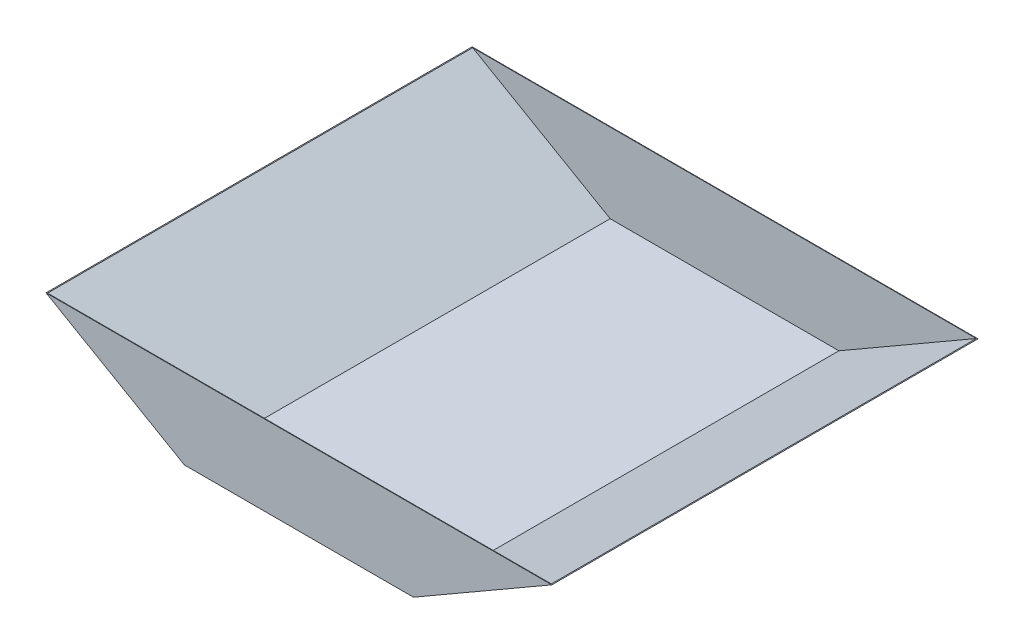
ISO-10303-21;
HEADER;
FILE_DESCRIPTION(('STEP AP214'),'2;1');
FILE_NAME('part.step','',(''),(''),'','','');
FILE_SCHEMA(('AUTOMOTIVE_DESIGN { 1 0 10303 214 1 1 1 1 }'));
ENDSEC;
DATA;
#1=APPLICATION_CONTEXT('core data for automotive mechanical design processes');
#2=APPLICATION_PROTOCOL_DEFINITION('international standard','automotive_design',2000,#1);
#3=PRODUCT_CONTEXT('',#1,'mechanical');
#4=PRODUCT('Part','Part','',(#3));
#5=PRODUCT_RELATED_PRODUCT_CATEGORY('part','',(#4));
#6=PRODUCT_DEFINITION_FORMATION('','',#4);
#7=PRODUCT_DEFINITION_CONTEXT('part definition',#1,'design');
#8=PRODUCT_DEFINITION('design','',#6,#7);
#9=PRODUCT_DEFINITION_SHAPE('','',#8);
#10=(LENGTH_UNIT() NAMED_UNIT(*) SI_UNIT(.MILLI.,.METRE.));
#11=(NAMED_UNIT(*) PLANE_ANGLE_UNIT() SI_UNIT($,.RADIAN.));
#12=(NAMED_UNIT(*) SI_UNIT($,.STERADIAN.) SOLID_ANGLE_UNIT());
#13=UNCERTAINTY_MEASURE_WITH_UNIT(LENGTH_MEASURE(1.E-05),#10,'distance_accuracy_value','');
#14=(GEOMETRIC_REPRESENTATION_CONTEXT(3) GLOBAL_UNCERTAINTY_ASSIGNED_CONTEXT((#13)) GLOBAL_UNIT_ASSIGNED_CONTEXT((#10,
#11,#12)) REPRESENTATION_CONTEXT('',''));
#15=CARTESIAN_POINT('',(0.,0.,0.));
#16=DIRECTION('',(0.,0.,1.));
#17=DIRECTION('',(1.,0.,0.));
#18=AXIS2_PLACEMENT_3D('',#15,#16,#17);
#19=CARTESIAN_POINT('',(-288.507789686385,150.,800.));
#20=DIRECTION('',(0.,-1.,0.));
#21=DIRECTION('',(1.,0.,0.));
#22=AXIS2_PLACEMENT_3D('',#19,#20,#21);
#23=PLANE('',#22);
#24=DIRECTION('',(-1.,0.,0.));
#25=VECTOR('',#24,1.);
#26=CARTESIAN_POINT('',(-288.507789686385,150.,0.));
#27=LINE('',#26,#25);
#28=CARTESIAN_POINT('',(-288.507789686385,150.,0.));
#29=VERTEX_POINT('',#28);
#30=CARTESIAN_POINT('',(-1238.12303195705,150.,0.));
#31=VERTEX_POINT('',#30);
#32=EDGE_CURVE('E78',#29,#31,#27,.T.);
#33=ORIENTED_EDGE('',*,*,#32,.T.);
#34=DIRECTION('',(0.,0.,-1.));
#35=VECTOR('',#34,1.);
#36=CARTESIAN_POINT('',(-1238.12303195705,150.,800.));
#37=LINE('',#36,#35);
#38=CARTESIAN_POINT('',(-1238.12303195705,150.,800.));
#39=VERTEX_POINT('',#38);
#40=EDGE_CURVE('E150',#39,#31,#37,.T.);
#41=ORIENTED_EDGE('',*,*,#40,.F.);
#42=DIRECTION('',(-1.,0.,0.));
#43=VECTOR('',#42,1.);
#44=CARTESIAN_POINT('',(-288.507789686385,150.,800.));
#45=LINE('',#44,#43);
#46=CARTESIAN_POINT('',(-288.507789686385,150.,800.));
#47=VERTEX_POINT('',#46);
#48=EDGE_CURVE('E57',#47,#39,#45,.T.);
#49=ORIENTED_EDGE('',*,*,#48,.F.);
#50=DIRECTION('',(0.,0.,-1.));
#51=VECTOR('',#50,1.);
#52=CARTESIAN_POINT('',(-288.507789686385,150.,800.));
#53=LINE('',#52,#51);
#54=EDGE_CURVE('E160',#47,#29,#53,.T.);
#55=ORIENTED_EDGE('',*,*,#54,.T.);
#56=EDGE_LOOP('',(#33,#41,#49,#55));
#57=FACE_BOUND('',#56,.T.);
#58=DIRECTION('',(-1.,0.,0.));
#59=VECTOR('',#58,1.);
#60=CARTESIAN_POINT('',(-288.507789686385,150.,1.));
#61=LINE('',#60,#59);
#62=CARTESIAN_POINT('',(-290.507789686385,150.,1.));
#63=VERTEX_POINT('',#62);
#64=CARTESIAN_POINT('',(-1236.12303195705,150.,1.));
#65=VERTEX_POINT('',#64);
#66=EDGE_CURVE('E131',#63,#65,#61,.T.);
#67=ORIENTED_EDGE('',*,*,#66,.F.);
#68=DIRECTION('',(0.,0.,-1.));
#69=VECTOR('',#68,1.);
#70=CARTESIAN_POINT('',(-290.507789686386,150.,800.));
#71=LINE('',#70,#69);
#72=CARTESIAN_POINT('',(-290.507789686385,150.,799.));
#73=VERTEX_POINT('',#72);
#74=EDGE_CURVE('E126',#73,#63,#71,.T.);
#75=ORIENTED_EDGE('',*,*,#74,.F.);
#76=DIRECTION('',(-1.,0.,0.));
#77=VECTOR('',#76,1.);
#78=CARTESIAN_POINT('',(-288.507789686385,150.,799.));
#79=LINE('',#78,#77);
#80=CARTESIAN_POINT('',(-1236.12303195705,150.,799.));
#81=VERTEX_POINT('',#80);
#82=EDGE_CURVE('E48',#73,#81,#79,.T.);
#83=ORIENTED_EDGE('',*,*,#82,.T.);
#84=DIRECTION('',(0.,0.,-1.));
#85=VECTOR('',#84,1.);
#86=CARTESIAN_POINT('',(-1236.12303195705,150.,800.));
#87=LINE('',#86,#85);
#88=EDGE_CURVE('E139',#81,#65,#87,.T.);
#89=ORIENTED_EDGE('',*,*,#88,.T.);
#90=EDGE_LOOP('',(#67,#75,#83,#89));
#91=FACE_BOUND('',#90,.T.);
#92=ADVANCED_FACE('F33',(#57,#91),#23,.F.);
#93=CARTESIAN_POINT('',(-1238.12303195705,150.,800.));
#94=DIRECTION('',(0.500000000000001,0.866025403784438,0.));
#95=DIRECTION('',(-0.866025403784438,0.500000000000001,0.));
#96=AXIS2_PLACEMENT_3D('',#93,#94,#95);
#97=PLANE('',#96);
#98=DIRECTION('',(0.866025403784438,-0.500000000000001,0.));
#99=VECTOR('',#98,1.);
#100=CARTESIAN_POINT('',(-1238.12303195705,150.,0.));
#101=LINE('',#100,#99);
#102=CARTESIAN_POINT('',(-978.315410821717,0.,0.));
#103=VERTEX_POINT('',#102);
#104=EDGE_CURVE('E151',#31,#103,#101,.T.);
#105=ORIENTED_EDGE('',*,*,#104,.T.);
#106=DIRECTION('',(0.,0.,-1.));
#107=VECTOR('',#106,1.);
#108=CARTESIAN_POINT('',(-978.315410821717,0.,800.));
#109=LINE('',#108,#107);
#110=CARTESIAN_POINT('',(-978.315410821717,0.,800.));
#111=VERTEX_POINT('',#110);
#112=EDGE_CURVE('E11',#111,#103,#109,.T.);
#113=ORIENTED_EDGE('',*,*,#112,.F.);
#114=DIRECTION('',(0.866025403784438,-0.500000000000001,0.));
#115=VECTOR('',#114,1.);
#116=CARTESIAN_POINT('',(-1238.12303195705,150.,800.));
#117=LINE('',#116,#115);
#118=EDGE_CURVE('E144',#39,#111,#117,.T.);
#119=ORIENTED_EDGE('',*,*,#118,.F.);
#120=ORIENTED_EDGE('',*,*,#40,.T.);
#121=EDGE_LOOP('',(#105,#113,#119,#120));
#122=FACE_BOUND('',#121,.T.);
#123=ADVANCED_FACE('F35',(#122),#97,.F.);
#124=CARTESIAN_POINT('',(-978.315410821717,0.,800.));
#125=DIRECTION('',(0.,1.,0.));
#126=DIRECTION('',(0.,0.,1.));
#127=AXIS2_PLACEMENT_3D('',#124,#125,#126);
#128=PLANE('',#127);
#129=DIRECTION('',(1.,0.,0.));
#130=VECTOR('',#129,1.);
#131=CARTESIAN_POINT('',(-978.315410821717,0.,0.));
#132=LINE('',#131,#130);
#133=CARTESIAN_POINT('',(-548.315410821717,0.,0.));
#134=VERTEX_POINT('',#133);
#135=EDGE_CURVE('E154',#103,#134,#132,.T.);
#136=ORIENTED_EDGE('',*,*,#135,.T.);
#137=DIRECTION('',(0.,0.,-1.));
#138=VECTOR('',#137,1.);
#139=CARTESIAN_POINT('',(-548.315410821717,0.,800.));
#140=LINE('',#139,#138);
#141=CARTESIAN_POINT('',(-548.315410821717,0.,800.));
#142=VERTEX_POINT('',#141);
#143=EDGE_CURVE('E41',#142,#134,#140,.T.);
#144=ORIENTED_EDGE('',*,*,#143,.F.);
#145=DIRECTION('',(1.,0.,0.));
#146=VECTOR('',#145,1.);
#147=CARTESIAN_POINT('',(-978.315410821717,0.,800.));
#148=LINE('',#147,#146);
#149=EDGE_CURVE('E85',#111,#142,#148,.T.);
#150=ORIENTED_EDGE('',*,*,#149,.F.);
#151=ORIENTED_EDGE('',*,*,#112,.T.);
#152=EDGE_LOOP('',(#136,#144,#150,#151));
#153=FACE_BOUND('',#152,.T.);
#154=ADVANCED_FACE('F199',(#153),#128,.F.);
#155=CARTESIAN_POINT('',(-548.315410821717,0.,800.));
#156=DIRECTION('',(-0.500000000000002,0.866025403784438,0.));
#157=DIRECTION('',(-0.866025403784438,-0.500000000000002,0.));
#158=AXIS2_PLACEMENT_3D('',#155,#156,#157);
#159=PLANE('',#158);
#160=DIRECTION('',(0.866025403784438,0.500000000000002,0.));
#161=VECTOR('',#160,1.);
#162=CARTESIAN_POINT('',(-548.315410821717,0.,0.));
#163=LINE('',#162,#161);
#164=EDGE_CURVE('E156',#134,#29,#163,.T.);
#165=ORIENTED_EDGE('',*,*,#164,.T.);
#166=ORIENTED_EDGE('',*,*,#54,.F.);
#167=DIRECTION('',(0.866025403784438,0.500000000000002,0.));
#168=VECTOR('',#167,1.);
#169=CARTESIAN_POINT('',(-548.315410821717,0.,800.));
#170=LINE('',#169,#168);
#171=EDGE_CURVE('E147',#142,#47,#170,.T.);
#172=ORIENTED_EDGE('',*,*,#171,.F.);
#173=ORIENTED_EDGE('',*,*,#143,.T.);
#174=EDGE_LOOP('',(#165,#166,#172,#173));
#175=FACE_BOUND('',#174,.T.);
#176=ADVANCED_FACE('F165',(#175),#159,.F.);
#177=CARTESIAN_POINT('',(0.,0.,800.));
#178=DIRECTION('',(0.,0.,1.));
#179=DIRECTION('',(1.,0.,0.));
#180=AXIS2_PLACEMENT_3D('',#177,#178,#179);
#181=PLANE('',#180);
#182=ORIENTED_EDGE('',*,*,#118,.T.);
#183=ORIENTED_EDGE('',*,*,#149,.T.);
#184=ORIENTED_EDGE('',*,*,#171,.T.);
#185=ORIENTED_EDGE('',*,*,#48,.T.);
#186=EDGE_LOOP('',(#182,#183,#184,#185));
#187=FACE_BOUND('',#186,.T.);
#188=ADVANCED_FACE('F193',(#187),#181,.T.);
#189=CARTESIAN_POINT('',(0.,0.,0.));
#190=DIRECTION('',(0.,0.,1.));
#191=DIRECTION('',(1.,0.,0.));
#192=AXIS2_PLACEMENT_3D('',#189,#190,#191);
#193=PLANE('',#192);
#194=ORIENTED_EDGE('',*,*,#104,.F.);
#195=ORIENTED_EDGE('',*,*,#32,.F.);
#196=ORIENTED_EDGE('',*,*,#164,.F.);
#197=ORIENTED_EDGE('',*,*,#135,.F.);
#198=EDGE_LOOP('',(#194,#195,#196,#197));
#199=FACE_BOUND('',#198,.T.);
#200=ADVANCED_FACE('F169',(#199),#193,.F.);
#201=CARTESIAN_POINT('',(-1237.62303195705,150.866025403785,800.));
#202=DIRECTION('',(0.500000000000001,0.866025403784438,0.));
#203=DIRECTION('',(-0.866025403784438,0.500000000000001,0.));
#204=AXIS2_PLACEMENT_3D('',#201,#202,#203);
#205=PLANE('',#204);
#206=DIRECTION('',(0.866025403784438,-0.500000000000001,0.));
#207=VECTOR('',#206,1.);
#208=CARTESIAN_POINT('',(-1237.62303195705,150.866025403785,1.));
#209=LINE('',#208,#207);
#210=CARTESIAN_POINT('',(-978.047461629286,1.,1.));
#211=VERTEX_POINT('',#210);
#212=EDGE_CURVE('E115',#65,#211,#209,.T.);
#213=ORIENTED_EDGE('',*,*,#212,.F.);
#214=ORIENTED_EDGE('',*,*,#88,.F.);
#215=DIRECTION('',(0.866025403784438,-0.500000000000001,0.));
#216=VECTOR('',#215,1.);
#217=CARTESIAN_POINT('',(-1237.62303195705,150.866025403785,799.));
#218=LINE('',#217,#216);
#219=CARTESIAN_POINT('',(-978.047461629286,1.,799.));
#220=VERTEX_POINT('',#219);
#221=EDGE_CURVE('E133',#81,#220,#218,.T.);
#222=ORIENTED_EDGE('',*,*,#221,.T.);
#223=DIRECTION('',(0.,0.,-1.));
#224=VECTOR('',#223,1.);
#225=CARTESIAN_POINT('',(-978.047461629286,1.,800.));
#226=LINE('',#225,#224);
#227=EDGE_CURVE('E125',#220,#211,#226,.T.);
#228=ORIENTED_EDGE('',*,*,#227,.T.);
#229=EDGE_LOOP('',(#213,#214,#222,#228));
#230=FACE_BOUND('',#229,.T.);
#231=ADVANCED_FACE('F177',(#230),#205,.T.);
#232=CARTESIAN_POINT('',(-978.315410821717,1.,800.));
#233=DIRECTION('',(0.,1.,0.));
#234=DIRECTION('',(0.,0.,1.));
#235=AXIS2_PLACEMENT_3D('',#232,#233,#234);
#236=PLANE('',#235);
#237=DIRECTION('',(1.,0.,0.));
#238=VECTOR('',#237,1.);
#239=CARTESIAN_POINT('',(-978.315410821717,1.,1.));
#240=LINE('',#239,#238);
#241=CARTESIAN_POINT('',(-548.583360014148,1.,1.));
#242=VERTEX_POINT('',#241);
#243=EDGE_CURVE('E108',#211,#242,#240,.T.);
#244=ORIENTED_EDGE('',*,*,#243,.F.);
#245=ORIENTED_EDGE('',*,*,#227,.F.);
#246=DIRECTION('',(1.,0.,0.));
#247=VECTOR('',#246,1.);
#248=CARTESIAN_POINT('',(-978.315410821717,1.,799.));
#249=LINE('',#248,#247);
#250=CARTESIAN_POINT('',(-548.583360014148,1.,799.));
#251=VERTEX_POINT('',#250);
#252=EDGE_CURVE('E123',#220,#251,#249,.T.);
#253=ORIENTED_EDGE('',*,*,#252,.T.);
#254=DIRECTION('',(0.,0.,-1.));
#255=VECTOR('',#254,1.);
#256=CARTESIAN_POINT('',(-548.583360014148,1.,800.));
#257=LINE('',#256,#255);
#258=EDGE_CURVE('E121',#251,#242,#257,.T.);
#259=ORIENTED_EDGE('',*,*,#258,.T.);
#260=EDGE_LOOP('',(#244,#245,#253,#259));
#261=FACE_BOUND('',#260,.T.);
#262=ADVANCED_FACE('F122',(#261),#236,.T.);
#263=CARTESIAN_POINT('',(-548.815410821717,0.866025403784438,800.));
#264=DIRECTION('',(-0.500000000000002,0.866025403784438,0.));
#265=DIRECTION('',(-0.866025403784438,-0.500000000000002,0.));
#266=AXIS2_PLACEMENT_3D('',#263,#264,#265);
#267=PLANE('',#266);
#268=DIRECTION('',(0.866025403784438,0.500000000000002,0.));
#269=VECTOR('',#268,1.);
#270=CARTESIAN_POINT('',(-548.815410821717,0.866025403784438,1.));
#271=LINE('',#270,#269);
#272=EDGE_CURVE('E112',#242,#63,#271,.T.);
#273=ORIENTED_EDGE('',*,*,#272,.F.);
#274=ORIENTED_EDGE('',*,*,#258,.F.);
#275=DIRECTION('',(0.866025403784438,0.500000000000002,0.));
#276=VECTOR('',#275,1.);
#277=CARTESIAN_POINT('',(-548.815410821717,0.866025403784438,799.));
#278=LINE('',#277,#276);
#279=EDGE_CURVE('E137',#251,#73,#278,.T.);
#280=ORIENTED_EDGE('',*,*,#279,.T.);
#281=ORIENTED_EDGE('',*,*,#74,.T.);
#282=EDGE_LOOP('',(#273,#274,#280,#281));
#283=FACE_BOUND('',#282,.T.);
#284=ADVANCED_FACE('F128',(#283),#267,.T.);
#285=CARTESIAN_POINT('',(0.,0.,799.));
#286=DIRECTION('',(0.,0.,1.));
#287=DIRECTION('',(1.,0.,0.));
#288=AXIS2_PLACEMENT_3D('',#285,#286,#287);
#289=PLANE('',#288);
#290=ORIENTED_EDGE('',*,*,#221,.F.);
#291=ORIENTED_EDGE('',*,*,#82,.F.);
#292=ORIENTED_EDGE('',*,*,#279,.F.);
#293=ORIENTED_EDGE('',*,*,#252,.F.);
#294=EDGE_LOOP('',(#290,#291,#292,#293));
#295=FACE_BOUND('',#294,.T.);
#296=ADVANCED_FACE('F182',(#295),#289,.F.);
#297=CARTESIAN_POINT('',(0.,0.,1.));
#298=DIRECTION('',(0.,0.,1.));
#299=DIRECTION('',(1.,0.,0.));
#300=AXIS2_PLACEMENT_3D('',#297,#298,#299);
#301=PLANE('',#300);
#302=ORIENTED_EDGE('',*,*,#212,.T.);
#303=ORIENTED_EDGE('',*,*,#243,.T.);
#304=ORIENTED_EDGE('',*,*,#272,.T.);
#305=ORIENTED_EDGE('',*,*,#66,.T.);
#306=EDGE_LOOP('',(#302,#303,#304,#305));
#307=FACE_BOUND('',#306,.T.);
#308=ADVANCED_FACE('F110',(#307),#301,.T.);
#309=CLOSED_SHELL('',(#92,#123,#154,#176,#188,#200,#231,#262,#284,#296,#308));
#310=MANIFOLD_SOLID_BREP('B2',#309);
#311=ADVANCED_BREP_SHAPE_REPRESENTATION('',(#18,#310),#14);
#312=SHAPE_DEFINITION_REPRESENTATION(#9,#311);
ENDSEC;
END-ISO-10303-21;
